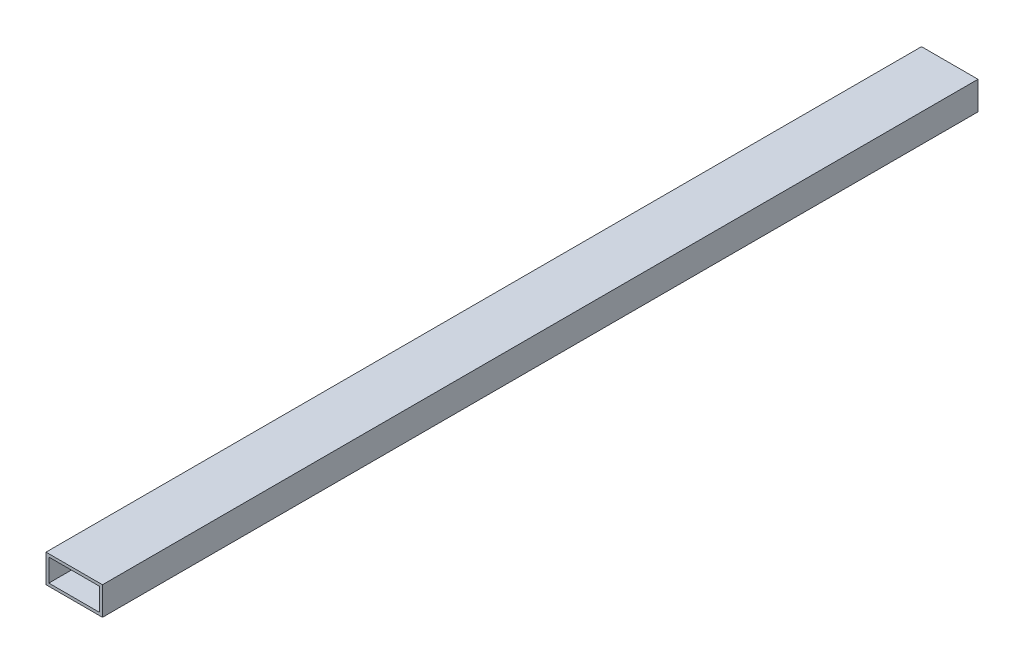
ISO-10303-21;
HEADER;
FILE_DESCRIPTION(('STEP AP214'),'2;1');
FILE_NAME('part.step','',(''),(''),'','','');
FILE_SCHEMA(('AUTOMOTIVE_DESIGN { 1 0 10303 214 1 1 1 1 }'));
ENDSEC;
DATA;
#1=APPLICATION_CONTEXT('core data for automotive mechanical design processes');
#2=APPLICATION_PROTOCOL_DEFINITION('international standard','automotive_design',2000,#1);
#3=PRODUCT_CONTEXT('',#1,'mechanical');
#4=PRODUCT('Part','Part','',(#3));
#5=PRODUCT_RELATED_PRODUCT_CATEGORY('part','',(#4));
#6=PRODUCT_DEFINITION_FORMATION('','',#4);
#7=PRODUCT_DEFINITION_CONTEXT('part definition',#1,'design');
#8=PRODUCT_DEFINITION('design','',#6,#7);
#9=PRODUCT_DEFINITION_SHAPE('','',#8);
#10=(LENGTH_UNIT() NAMED_UNIT(*) SI_UNIT(.MILLI.,.METRE.));
#11=(NAMED_UNIT(*) PLANE_ANGLE_UNIT() SI_UNIT($,.RADIAN.));
#12=(NAMED_UNIT(*) SI_UNIT($,.STERADIAN.) SOLID_ANGLE_UNIT());
#13=UNCERTAINTY_MEASURE_WITH_UNIT(LENGTH_MEASURE(1.E-05),#10,'distance_accuracy_value','');
#14=(GEOMETRIC_REPRESENTATION_CONTEXT(3) GLOBAL_UNCERTAINTY_ASSIGNED_CONTEXT((#13)) GLOBAL_UNIT_ASSIGNED_CONTEXT((#10,
#11,#12)) REPRESENTATION_CONTEXT('',''));
#15=CARTESIAN_POINT('',(0.,0.,0.));
#16=DIRECTION('',(0.,0.,1.));
#17=DIRECTION('',(1.,0.,0.));
#18=AXIS2_PLACEMENT_3D('',#15,#16,#17);
#19=CARTESIAN_POINT('',(0.,0.,620.));
#20=DIRECTION('',(0.,0.,1.));
#21=DIRECTION('',(1.,0.,0.));
#22=AXIS2_PLACEMENT_3D('',#19,#20,#21);
#23=PLANE('',#22);
#24=DIRECTION('',(0.,-1.,0.));
#25=VECTOR('',#24,1.);
#26=CARTESIAN_POINT('',(-44.3827226043398,11.1114009011033,620.));
#27=LINE('',#26,#25);
#28=CARTESIAN_POINT('',(-44.3827226043398,11.1114009011033,620.));
#29=VERTEX_POINT('',#28);
#30=CARTESIAN_POINT('',(-44.3827226043398,-8.88859909889674,620.));
#31=VERTEX_POINT('',#30);
#32=EDGE_CURVE('E134',#29,#31,#27,.T.);
#33=ORIENTED_EDGE('',*,*,#32,.T.);
#34=DIRECTION('',(1.,0.,0.));
#35=VECTOR('',#34,1.);
#36=CARTESIAN_POINT('',(-44.3827226043398,-8.88859909889674,620.));
#37=LINE('',#36,#35);
#38=CARTESIAN_POINT('',(-4.38272260433983,-8.88859909889674,620.));
#39=VERTEX_POINT('',#38);
#40=EDGE_CURVE('E137',#31,#39,#37,.T.);
#41=ORIENTED_EDGE('',*,*,#40,.T.);
#42=DIRECTION('',(0.,1.,0.));
#43=VECTOR('',#42,1.);
#44=CARTESIAN_POINT('',(-4.38272260433983,11.1114009011033,620.));
#45=LINE('',#44,#43);
#46=CARTESIAN_POINT('',(-4.38272260433983,11.1114009011033,620.));
#47=VERTEX_POINT('',#46);
#48=EDGE_CURVE('E140',#39,#47,#45,.T.);
#49=ORIENTED_EDGE('',*,*,#48,.T.);
#50=DIRECTION('',(-1.,0.,0.));
#51=VECTOR('',#50,1.);
#52=CARTESIAN_POINT('',(-44.3827226043398,11.1114009011033,620.));
#53=LINE('',#52,#51);
#54=EDGE_CURVE('E142',#47,#29,#53,.T.);
#55=ORIENTED_EDGE('',*,*,#54,.T.);
#56=EDGE_LOOP('',(#33,#41,#49,#55));
#57=FACE_BOUND('',#56,.T.);
#58=DIRECTION('',(1.,0.,0.));
#59=VECTOR('',#58,1.);
#60=CARTESIAN_POINT('',(-42.3827226043398,-6.88859909889674,620.));
#61=LINE('',#60,#59);
#62=CARTESIAN_POINT('',(-42.3827226043398,-6.88859909889674,620.));
#63=VERTEX_POINT('',#62);
#64=CARTESIAN_POINT('',(-6.38272260433984,-6.88859909889674,620.));
#65=VERTEX_POINT('',#64);
#66=EDGE_CURVE('E106',#63,#65,#61,.T.);
#67=ORIENTED_EDGE('',*,*,#66,.F.);
#68=DIRECTION('',(0.,-1.,0.));
#69=VECTOR('',#68,1.);
#70=CARTESIAN_POINT('',(-42.3827226043398,9.11140090110326,620.));
#71=LINE('',#70,#69);
#72=CARTESIAN_POINT('',(-42.3827226043398,9.11140090110326,620.));
#73=VERTEX_POINT('',#72);
#74=EDGE_CURVE('E98',#73,#63,#71,.T.);
#75=ORIENTED_EDGE('',*,*,#74,.F.);
#76=DIRECTION('',(-1.,0.,0.));
#77=VECTOR('',#76,1.);
#78=CARTESIAN_POINT('',(-42.3827226043398,9.11140090110326,620.));
#79=LINE('',#78,#77);
#80=CARTESIAN_POINT('',(-6.38272260433984,9.11140090110326,620.));
#81=VERTEX_POINT('',#80);
#82=EDGE_CURVE('E120',#81,#73,#79,.T.);
#83=ORIENTED_EDGE('',*,*,#82,.F.);
#84=DIRECTION('',(0.,1.,0.));
#85=VECTOR('',#84,1.);
#86=CARTESIAN_POINT('',(-6.38272260433984,9.11140090110326,620.));
#87=LINE('',#86,#85);
#88=EDGE_CURVE('E118',#65,#81,#87,.T.);
#89=ORIENTED_EDGE('',*,*,#88,.F.);
#90=EDGE_LOOP('',(#67,#75,#83,#89));
#91=FACE_BOUND('',#90,.T.);
#92=ADVANCED_FACE('F33',(#57,#91),#23,.T.);
#93=CARTESIAN_POINT('',(0.,0.,0.));
#94=DIRECTION('',(0.,0.,1.));
#95=DIRECTION('',(1.,0.,0.));
#96=AXIS2_PLACEMENT_3D('',#93,#94,#95);
#97=PLANE('',#96);
#98=DIRECTION('',(0.,-1.,0.));
#99=VECTOR('',#98,1.);
#100=CARTESIAN_POINT('',(-44.3827226043398,11.1114009011033,0.));
#101=LINE('',#100,#99);
#102=CARTESIAN_POINT('',(-44.3827226043398,11.1114009011033,0.));
#103=VERTEX_POINT('',#102);
#104=CARTESIAN_POINT('',(-44.3827226043398,-8.88859909889674,0.));
#105=VERTEX_POINT('',#104);
#106=EDGE_CURVE('E114',#103,#105,#101,.T.);
#107=ORIENTED_EDGE('',*,*,#106,.F.);
#108=DIRECTION('',(-1.,0.,0.));
#109=VECTOR('',#108,1.);
#110=CARTESIAN_POINT('',(-44.3827226043398,11.1114009011033,0.));
#111=LINE('',#110,#109);
#112=CARTESIAN_POINT('',(-4.38272260433983,11.1114009011033,0.));
#113=VERTEX_POINT('',#112);
#114=EDGE_CURVE('E138',#113,#103,#111,.T.);
#115=ORIENTED_EDGE('',*,*,#114,.F.);
#116=DIRECTION('',(0.,1.,0.));
#117=VECTOR('',#116,1.);
#118=CARTESIAN_POINT('',(-4.38272260433983,11.1114009011033,0.));
#119=LINE('',#118,#117);
#120=CARTESIAN_POINT('',(-4.38272260433983,-8.88859909889674,0.));
#121=VERTEX_POINT('',#120);
#122=EDGE_CURVE('E149',#121,#113,#119,.T.);
#123=ORIENTED_EDGE('',*,*,#122,.F.);
#124=DIRECTION('',(1.,0.,0.));
#125=VECTOR('',#124,1.);
#126=CARTESIAN_POINT('',(-44.3827226043398,-8.88859909889674,0.));
#127=LINE('',#126,#125);
#128=EDGE_CURVE('E147',#105,#121,#127,.T.);
#129=ORIENTED_EDGE('',*,*,#128,.F.);
#130=EDGE_LOOP('',(#107,#115,#123,#129));
#131=FACE_BOUND('',#130,.T.);
#132=DIRECTION('',(0.,-1.,0.));
#133=VECTOR('',#132,1.);
#134=CARTESIAN_POINT('',(-42.3827226043398,9.11140090110326,0.));
#135=LINE('',#134,#133);
#136=CARTESIAN_POINT('',(-42.3827226043398,9.11140090110326,0.));
#137=VERTEX_POINT('',#136);
#138=CARTESIAN_POINT('',(-42.3827226043398,-6.88859909889674,0.));
#139=VERTEX_POINT('',#138);
#140=EDGE_CURVE('E56',#137,#139,#135,.T.);
#141=ORIENTED_EDGE('',*,*,#140,.T.);
#142=DIRECTION('',(1.,0.,0.));
#143=VECTOR('',#142,1.);
#144=CARTESIAN_POINT('',(-42.3827226043398,-6.88859909889674,0.));
#145=LINE('',#144,#143);
#146=CARTESIAN_POINT('',(-6.38272260433984,-6.88859909889674,0.));
#147=VERTEX_POINT('',#146);
#148=EDGE_CURVE('E113',#139,#147,#145,.T.);
#149=ORIENTED_EDGE('',*,*,#148,.T.);
#150=DIRECTION('',(0.,1.,0.));
#151=VECTOR('',#150,1.);
#152=CARTESIAN_POINT('',(-6.38272260433984,9.11140090110326,0.));
#153=LINE('',#152,#151);
#154=CARTESIAN_POINT('',(-6.38272260433984,9.11140090110326,0.));
#155=VERTEX_POINT('',#154);
#156=EDGE_CURVE('E126',#147,#155,#153,.T.);
#157=ORIENTED_EDGE('',*,*,#156,.T.);
#158=DIRECTION('',(-1.,0.,0.));
#159=VECTOR('',#158,1.);
#160=CARTESIAN_POINT('',(-42.3827226043398,9.11140090110326,0.));
#161=LINE('',#160,#159);
#162=EDGE_CURVE('E107',#155,#137,#161,.T.);
#163=ORIENTED_EDGE('',*,*,#162,.T.);
#164=EDGE_LOOP('',(#141,#149,#157,#163));
#165=FACE_BOUND('',#164,.T.);
#166=ADVANCED_FACE('F167',(#131,#165),#97,.F.);
#167=CARTESIAN_POINT('',(-44.3827226043398,11.1114009011033,620.));
#168=DIRECTION('',(1.,0.,0.));
#169=DIRECTION('',(0.,0.,-1.));
#170=AXIS2_PLACEMENT_3D('',#167,#168,#169);
#171=PLANE('',#170);
#172=ORIENTED_EDGE('',*,*,#106,.T.);
#173=DIRECTION('',(0.,0.,-1.));
#174=VECTOR('',#173,1.);
#175=CARTESIAN_POINT('',(-44.3827226043398,-8.88859909889674,620.));
#176=LINE('',#175,#174);
#177=EDGE_CURVE('E11',#31,#105,#176,.T.);
#178=ORIENTED_EDGE('',*,*,#177,.F.);
#179=ORIENTED_EDGE('',*,*,#32,.F.);
#180=DIRECTION('',(0.,0.,-1.));
#181=VECTOR('',#180,1.);
#182=CARTESIAN_POINT('',(-44.3827226043398,11.1114009011033,620.));
#183=LINE('',#182,#181);
#184=EDGE_CURVE('E144',#29,#103,#183,.T.);
#185=ORIENTED_EDGE('',*,*,#184,.T.);
#186=EDGE_LOOP('',(#172,#178,#179,#185));
#187=FACE_BOUND('',#186,.T.);
#188=ADVANCED_FACE('F35',(#187),#171,.F.);
#189=CARTESIAN_POINT('',(-44.3827226043398,-8.88859909889674,620.));
#190=DIRECTION('',(0.,1.,0.));
#191=DIRECTION('',(0.,0.,1.));
#192=AXIS2_PLACEMENT_3D('',#189,#190,#191);
#193=PLANE('',#192);
#194=ORIENTED_EDGE('',*,*,#128,.T.);
#195=DIRECTION('',(0.,0.,-1.));
#196=VECTOR('',#195,1.);
#197=CARTESIAN_POINT('',(-4.38272260433983,-8.88859909889674,620.));
#198=LINE('',#197,#196);
#199=EDGE_CURVE('E41',#39,#121,#198,.T.);
#200=ORIENTED_EDGE('',*,*,#199,.F.);
#201=ORIENTED_EDGE('',*,*,#40,.F.);
#202=ORIENTED_EDGE('',*,*,#177,.T.);
#203=EDGE_LOOP('',(#194,#200,#201,#202));
#204=FACE_BOUND('',#203,.T.);
#205=ADVANCED_FACE('F177',(#204),#193,.F.);
#206=CARTESIAN_POINT('',(-4.38272260433983,11.1114009011033,620.));
#207=DIRECTION('',(-1.,0.,0.));
#208=DIRECTION('',(0.,0.,1.));
#209=AXIS2_PLACEMENT_3D('',#206,#207,#208);
#210=PLANE('',#209);
#211=ORIENTED_EDGE('',*,*,#122,.T.);
#212=DIRECTION('',(0.,0.,-1.));
#213=VECTOR('',#212,1.);
#214=CARTESIAN_POINT('',(-4.38272260433983,11.1114009011033,620.));
#215=LINE('',#214,#213);
#216=EDGE_CURVE('E154',#47,#113,#215,.T.);
#217=ORIENTED_EDGE('',*,*,#216,.F.);
#218=ORIENTED_EDGE('',*,*,#48,.F.);
#219=ORIENTED_EDGE('',*,*,#199,.T.);
#220=EDGE_LOOP('',(#211,#217,#218,#219));
#221=FACE_BOUND('',#220,.T.);
#222=ADVANCED_FACE('F161',(#221),#210,.F.);
#223=CARTESIAN_POINT('',(-44.3827226043398,11.1114009011033,620.));
#224=DIRECTION('',(0.,-1.,0.));
#225=DIRECTION('',(0.,0.,-1.));
#226=AXIS2_PLACEMENT_3D('',#223,#224,#225);
#227=PLANE('',#226);
#228=ORIENTED_EDGE('',*,*,#114,.T.);
#229=ORIENTED_EDGE('',*,*,#184,.F.);
#230=ORIENTED_EDGE('',*,*,#54,.F.);
#231=ORIENTED_EDGE('',*,*,#216,.T.);
#232=EDGE_LOOP('',(#228,#229,#230,#231));
#233=FACE_BOUND('',#232,.T.);
#234=ADVANCED_FACE('F171',(#233),#227,.F.);
#235=CARTESIAN_POINT('',(-42.3827226043398,9.11140090110326,620.));
#236=DIRECTION('',(1.,0.,0.));
#237=DIRECTION('',(0.,0.,-1.));
#238=AXIS2_PLACEMENT_3D('',#235,#236,#237);
#239=PLANE('',#238);
#240=ORIENTED_EDGE('',*,*,#140,.F.);
#241=DIRECTION('',(0.,0.,-1.));
#242=VECTOR('',#241,1.);
#243=CARTESIAN_POINT('',(-42.3827226043398,9.11140090110326,620.));
#244=LINE('',#243,#242);
#245=EDGE_CURVE('E102',#73,#137,#244,.T.);
#246=ORIENTED_EDGE('',*,*,#245,.F.);
#247=ORIENTED_EDGE('',*,*,#74,.T.);
#248=DIRECTION('',(0.,0.,-1.));
#249=VECTOR('',#248,1.);
#250=CARTESIAN_POINT('',(-42.3827226043398,-6.88859909889674,620.));
#251=LINE('',#250,#249);
#252=EDGE_CURVE('E101',#63,#139,#251,.T.);
#253=ORIENTED_EDGE('',*,*,#252,.T.);
#254=EDGE_LOOP('',(#240,#246,#247,#253));
#255=FACE_BOUND('',#254,.T.);
#256=ADVANCED_FACE('F100',(#255),#239,.T.);
#257=CARTESIAN_POINT('',(-42.3827226043398,-6.88859909889674,620.));
#258=DIRECTION('',(0.,1.,0.));
#259=DIRECTION('',(0.,0.,1.));
#260=AXIS2_PLACEMENT_3D('',#257,#258,#259);
#261=PLANE('',#260);
#262=ORIENTED_EDGE('',*,*,#148,.F.);
#263=ORIENTED_EDGE('',*,*,#252,.F.);
#264=ORIENTED_EDGE('',*,*,#66,.T.);
#265=DIRECTION('',(0.,0.,-1.));
#266=VECTOR('',#265,1.);
#267=CARTESIAN_POINT('',(-6.38272260433984,-6.88859909889674,620.));
#268=LINE('',#267,#266);
#269=EDGE_CURVE('E115',#65,#147,#268,.T.);
#270=ORIENTED_EDGE('',*,*,#269,.T.);
#271=EDGE_LOOP('',(#262,#263,#264,#270));
#272=FACE_BOUND('',#271,.T.);
#273=ADVANCED_FACE('F110',(#272),#261,.T.);
#274=CARTESIAN_POINT('',(-6.38272260433984,9.11140090110326,620.));
#275=DIRECTION('',(-1.,0.,0.));
#276=DIRECTION('',(0.,0.,1.));
#277=AXIS2_PLACEMENT_3D('',#274,#275,#276);
#278=PLANE('',#277);
#279=ORIENTED_EDGE('',*,*,#156,.F.);
#280=ORIENTED_EDGE('',*,*,#269,.F.);
#281=ORIENTED_EDGE('',*,*,#88,.T.);
#282=DIRECTION('',(0.,0.,-1.));
#283=VECTOR('',#282,1.);
#284=CARTESIAN_POINT('',(-6.38272260433984,9.11140090110326,620.));
#285=LINE('',#284,#283);
#286=EDGE_CURVE('E48',#81,#155,#285,.T.);
#287=ORIENTED_EDGE('',*,*,#286,.T.);
#288=EDGE_LOOP('',(#279,#280,#281,#287));
#289=FACE_BOUND('',#288,.T.);
#290=ADVANCED_FACE('F200',(#289),#278,.T.);
#291=CARTESIAN_POINT('',(-42.3827226043398,9.11140090110326,620.));
#292=DIRECTION('',(0.,-1.,0.));
#293=DIRECTION('',(0.,0.,-1.));
#294=AXIS2_PLACEMENT_3D('',#291,#292,#293);
#295=PLANE('',#294);
#296=ORIENTED_EDGE('',*,*,#162,.F.);
#297=ORIENTED_EDGE('',*,*,#286,.F.);
#298=ORIENTED_EDGE('',*,*,#82,.T.);
#299=ORIENTED_EDGE('',*,*,#245,.T.);
#300=EDGE_LOOP('',(#296,#297,#298,#299));
#301=FACE_BOUND('',#300,.T.);
#302=ADVANCED_FACE('F204',(#301),#295,.T.);
#303=CLOSED_SHELL('',(#92,#166,#188,#205,#222,#234,#256,#273,#290,#302));
#304=MANIFOLD_SOLID_BREP('B2',#303);
#305=ADVANCED_BREP_SHAPE_REPRESENTATION('',(#18,#304),#14);
#306=SHAPE_DEFINITION_REPRESENTATION(#9,#305);
ENDSEC;
END-ISO-10303-21;
